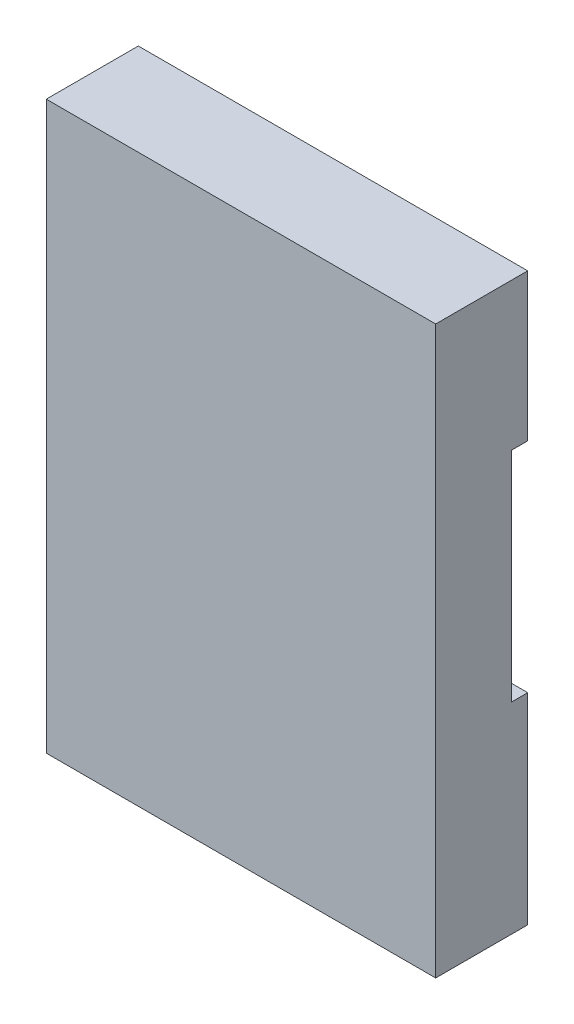
ISO-10303-21;
HEADER;
FILE_DESCRIPTION(('STEP AP214'),'2;1');
FILE_NAME('part.step','',(''),(''),'','','');
FILE_SCHEMA(('AUTOMOTIVE_DESIGN { 1 0 10303 214 1 1 1 1 }'));
ENDSEC;
DATA;
#1=APPLICATION_CONTEXT('core data for automotive mechanical design processes');
#2=APPLICATION_PROTOCOL_DEFINITION('international standard','automotive_design',2000,#1);
#3=PRODUCT_CONTEXT('',#1,'mechanical');
#4=PRODUCT('Part','Part','',(#3));
#5=PRODUCT_RELATED_PRODUCT_CATEGORY('part','',(#4));
#6=PRODUCT_DEFINITION_FORMATION('','',#4);
#7=PRODUCT_DEFINITION_CONTEXT('part definition',#1,'design');
#8=PRODUCT_DEFINITION('design','',#6,#7);
#9=PRODUCT_DEFINITION_SHAPE('','',#8);
#10=(LENGTH_UNIT() NAMED_UNIT(*) SI_UNIT(.MILLI.,.METRE.));
#11=(NAMED_UNIT(*) PLANE_ANGLE_UNIT() SI_UNIT($,.RADIAN.));
#12=(NAMED_UNIT(*) SI_UNIT($,.STERADIAN.) SOLID_ANGLE_UNIT());
#13=UNCERTAINTY_MEASURE_WITH_UNIT(LENGTH_MEASURE(1.E-05),#10,'distance_accuracy_value','');
#14=(GEOMETRIC_REPRESENTATION_CONTEXT(3) GLOBAL_UNCERTAINTY_ASSIGNED_CONTEXT((#13)) GLOBAL_UNIT_ASSIGNED_CONTEXT((#10,
#11,#12)) REPRESENTATION_CONTEXT('',''));
#15=CARTESIAN_POINT('',(0.,0.,0.));
#16=DIRECTION('',(0.,0.,1.));
#17=DIRECTION('',(1.,0.,0.));
#18=AXIS2_PLACEMENT_3D('',#15,#16,#17);
#19=CARTESIAN_POINT('',(13.75,20.,6.5));
#20=DIRECTION('',(-1.,0.,0.));
#21=DIRECTION('',(0.,-1.,0.));
#22=AXIS2_PLACEMENT_3D('',#19,#20,#21);
#23=PLANE('',#22);
#24=DIRECTION('',(0.,-1.,0.));
#25=VECTOR('',#24,1.);
#26=CARTESIAN_POINT('',(13.75,9.6,1.15));
#27=LINE('',#26,#25);
#28=CARTESIAN_POINT('',(13.75,9.6,1.15));
#29=VERTEX_POINT('',#28);
#30=CARTESIAN_POINT('',(13.75,-5.8,1.15));
#31=VERTEX_POINT('',#30);
#32=EDGE_CURVE('E181',#29,#31,#27,.T.);
#33=ORIENTED_EDGE('',*,*,#32,.F.);
#34=DIRECTION('',(0.,0.,-1.));
#35=VECTOR('',#34,1.);
#36=CARTESIAN_POINT('',(13.75,9.6,1.15));
#37=LINE('',#36,#35);
#38=CARTESIAN_POINT('',(13.75,9.6,0.));
#39=VERTEX_POINT('',#38);
#40=EDGE_CURVE('E206',#29,#39,#37,.T.);
#41=ORIENTED_EDGE('',*,*,#40,.T.);
#42=DIRECTION('',(0.,1.,0.));
#43=VECTOR('',#42,1.);
#44=CARTESIAN_POINT('',(13.75,20.,0.));
#45=LINE('',#44,#43);
#46=CARTESIAN_POINT('',(13.75,20.,0.));
#47=VERTEX_POINT('',#46);
#48=EDGE_CURVE('E210',#39,#47,#45,.T.);
#49=ORIENTED_EDGE('',*,*,#48,.T.);
#50=DIRECTION('',(0.,0.,-1.));
#51=VECTOR('',#50,1.);
#52=CARTESIAN_POINT('',(13.75,20.,6.5));
#53=LINE('',#52,#51);
#54=CARTESIAN_POINT('',(13.75,20.,6.5));
#55=VERTEX_POINT('',#54);
#56=EDGE_CURVE('E11',#55,#47,#53,.T.);
#57=ORIENTED_EDGE('',*,*,#56,.F.);
#58=DIRECTION('',(0.,1.,0.));
#59=VECTOR('',#58,1.);
#60=CARTESIAN_POINT('',(13.75,20.,6.5));
#61=LINE('',#60,#59);
#62=CARTESIAN_POINT('',(13.75,-20.,6.5));
#63=VERTEX_POINT('',#62);
#64=EDGE_CURVE('E219',#63,#55,#61,.T.);
#65=ORIENTED_EDGE('',*,*,#64,.F.);
#66=DIRECTION('',(0.,0.,-1.));
#67=VECTOR('',#66,1.);
#68=CARTESIAN_POINT('',(13.75,-20.,6.5));
#69=LINE('',#68,#67);
#70=CARTESIAN_POINT('',(13.75,-20.,0.));
#71=VERTEX_POINT('',#70);
#72=EDGE_CURVE('E233',#63,#71,#69,.T.);
#73=ORIENTED_EDGE('',*,*,#72,.T.);
#74=CARTESIAN_POINT('',(13.75,-5.8,0.));
#75=VERTEX_POINT('',#74);
#76=EDGE_CURVE('E234',#71,#75,#45,.T.);
#77=ORIENTED_EDGE('',*,*,#76,.T.);
#78=DIRECTION('',(0.,0.,-1.));
#79=VECTOR('',#78,1.);
#80=CARTESIAN_POINT('',(13.75,-5.8,1.15));
#81=LINE('',#80,#79);
#82=EDGE_CURVE('E64',#31,#75,#81,.T.);
#83=ORIENTED_EDGE('',*,*,#82,.F.);
#84=EDGE_LOOP('',(#33,#41,#49,#57,#65,#73,#77,#83));
#85=FACE_BOUND('',#84,.T.);
#86=ADVANCED_FACE('F41',(#85),#23,.F.);
#87=CARTESIAN_POINT('',(-13.75,20.,6.5));
#88=DIRECTION('',(0.,-1.,0.));
#89=DIRECTION('',(0.,0.,-1.));
#90=AXIS2_PLACEMENT_3D('',#87,#88,#89);
#91=PLANE('',#90);
#92=DIRECTION('',(-1.,0.,0.));
#93=VECTOR('',#92,1.);
#94=CARTESIAN_POINT('',(-13.75,20.,0.));
#95=LINE('',#94,#93);
#96=CARTESIAN_POINT('',(-13.75,20.,0.));
#97=VERTEX_POINT('',#96);
#98=EDGE_CURVE('E238',#47,#97,#95,.T.);
#99=ORIENTED_EDGE('',*,*,#98,.T.);
#100=DIRECTION('',(0.,0.,-1.));
#101=VECTOR('',#100,1.);
#102=CARTESIAN_POINT('',(-13.75,20.,6.5));
#103=LINE('',#102,#101);
#104=CARTESIAN_POINT('',(-13.75,20.,6.5));
#105=VERTEX_POINT('',#104);
#106=EDGE_CURVE('E49',#105,#97,#103,.T.);
#107=ORIENTED_EDGE('',*,*,#106,.F.);
#108=DIRECTION('',(-1.,0.,0.));
#109=VECTOR('',#108,1.);
#110=CARTESIAN_POINT('',(-13.75,20.,6.5));
#111=LINE('',#110,#109);
#112=EDGE_CURVE('E223',#55,#105,#111,.T.);
#113=ORIENTED_EDGE('',*,*,#112,.F.);
#114=ORIENTED_EDGE('',*,*,#56,.T.);
#115=EDGE_LOOP('',(#99,#107,#113,#114));
#116=FACE_BOUND('',#115,.T.);
#117=ADVANCED_FACE('F274',(#116),#91,.F.);
#118=CARTESIAN_POINT('',(-13.75,20.,6.5));
#119=DIRECTION('',(1.,0.,0.));
#120=DIRECTION('',(0.,1.,0.));
#121=AXIS2_PLACEMENT_3D('',#118,#119,#120);
#122=PLANE('',#121);
#123=DIRECTION('',(0.,-1.,0.));
#124=VECTOR('',#123,1.);
#125=CARTESIAN_POINT('',(-13.75,20.,0.));
#126=LINE('',#125,#124);
#127=CARTESIAN_POINT('',(-13.75,-20.,0.));
#128=VERTEX_POINT('',#127);
#129=EDGE_CURVE('E241',#97,#128,#126,.T.);
#130=ORIENTED_EDGE('',*,*,#129,.T.);
#131=DIRECTION('',(0.,0.,-1.));
#132=VECTOR('',#131,1.);
#133=CARTESIAN_POINT('',(-13.75,-20.,6.5));
#134=LINE('',#133,#132);
#135=CARTESIAN_POINT('',(-13.75,-20.,6.5));
#136=VERTEX_POINT('',#135);
#137=EDGE_CURVE('E250',#136,#128,#134,.T.);
#138=ORIENTED_EDGE('',*,*,#137,.F.);
#139=DIRECTION('',(0.,-1.,0.));
#140=VECTOR('',#139,1.);
#141=CARTESIAN_POINT('',(-13.75,20.,6.5));
#142=LINE('',#141,#140);
#143=EDGE_CURVE('E227',#105,#136,#142,.T.);
#144=ORIENTED_EDGE('',*,*,#143,.F.);
#145=ORIENTED_EDGE('',*,*,#106,.T.);
#146=EDGE_LOOP('',(#130,#138,#144,#145));
#147=FACE_BOUND('',#146,.T.);
#148=ADVANCED_FACE('F259',(#147),#122,.F.);
#149=CARTESIAN_POINT('',(-13.75,-20.,6.5));
#150=DIRECTION('',(0.,1.,0.));
#151=DIRECTION('',(0.,0.,1.));
#152=AXIS2_PLACEMENT_3D('',#149,#150,#151);
#153=PLANE('',#152);
#154=DIRECTION('',(-1.,0.,0.));
#155=VECTOR('',#154,1.);
#156=CARTESIAN_POINT('',(7.43638201632279,-20.,1.15));
#157=LINE('',#156,#155);
#158=CARTESIAN_POINT('',(7.43638201632279,-20.,1.15));
#159=VERTEX_POINT('',#158);
#160=CARTESIAN_POINT('',(-7.87577990601562,-20.,1.15));
#161=VERTEX_POINT('',#160);
#162=EDGE_CURVE('E149',#159,#161,#157,.T.);
#163=ORIENTED_EDGE('',*,*,#162,.F.);
#164=DIRECTION('',(0.,0.,-1.));
#165=VECTOR('',#164,1.);
#166=CARTESIAN_POINT('',(7.43638201632279,-20.,1.15));
#167=LINE('',#166,#165);
#168=CARTESIAN_POINT('',(7.43638201632279,-20.,0.));
#169=VERTEX_POINT('',#168);
#170=EDGE_CURVE('E132',#159,#169,#167,.T.);
#171=ORIENTED_EDGE('',*,*,#170,.T.);
#172=DIRECTION('',(1.,0.,0.));
#173=VECTOR('',#172,1.);
#174=CARTESIAN_POINT('',(-13.75,-20.,0.));
#175=LINE('',#174,#173);
#176=EDGE_CURVE('E244',#169,#71,#175,.T.);
#177=ORIENTED_EDGE('',*,*,#176,.T.);
#178=ORIENTED_EDGE('',*,*,#72,.F.);
#179=DIRECTION('',(1.,0.,0.));
#180=VECTOR('',#179,1.);
#181=CARTESIAN_POINT('',(-13.75,-20.,6.5));
#182=LINE('',#181,#180);
#183=EDGE_CURVE('E230',#136,#63,#182,.T.);
#184=ORIENTED_EDGE('',*,*,#183,.F.);
#185=ORIENTED_EDGE('',*,*,#137,.T.);
#186=CARTESIAN_POINT('',(-7.87577990601562,-20.,0.));
#187=VERTEX_POINT('',#186);
#188=EDGE_CURVE('E224',#128,#187,#175,.T.);
#189=ORIENTED_EDGE('',*,*,#188,.T.);
#190=DIRECTION('',(0.,0.,-1.));
#191=VECTOR('',#190,1.);
#192=CARTESIAN_POINT('',(-7.87577990601562,-20.,1.15));
#193=LINE('',#192,#191);
#194=EDGE_CURVE('E56',#161,#187,#193,.T.);
#195=ORIENTED_EDGE('',*,*,#194,.F.);
#196=EDGE_LOOP('',(#163,#171,#177,#178,#184,#185,#189,#195));
#197=FACE_BOUND('',#196,.T.);
#198=ADVANCED_FACE('F154',(#197),#153,.F.);
#199=CARTESIAN_POINT('',(0.,0.,6.5));
#200=DIRECTION('',(0.,0.,1.));
#201=DIRECTION('',(1.,0.,0.));
#202=AXIS2_PLACEMENT_3D('',#199,#200,#201);
#203=PLANE('',#202);
#204=ORIENTED_EDGE('',*,*,#64,.T.);
#205=ORIENTED_EDGE('',*,*,#112,.T.);
#206=ORIENTED_EDGE('',*,*,#143,.T.);
#207=ORIENTED_EDGE('',*,*,#183,.T.);
#208=EDGE_LOOP('',(#204,#205,#206,#207));
#209=FACE_BOUND('',#208,.T.);
#210=ADVANCED_FACE('F272',(#209),#203,.T.);
#211=CARTESIAN_POINT('',(0.,0.,0.));
#212=DIRECTION('',(0.,0.,1.));
#213=DIRECTION('',(1.,0.,0.));
#214=AXIS2_PLACEMENT_3D('',#211,#212,#213);
#215=PLANE('',#214);
#216=ORIENTED_EDGE('',*,*,#176,.F.);
#217=DIRECTION('',(0.,-1.,0.));
#218=VECTOR('',#217,1.);
#219=CARTESIAN_POINT('',(7.43638201632279,-20.,0.));
#220=LINE('',#219,#218);
#221=CARTESIAN_POINT('',(7.43638201632279,-17.75,0.));
#222=VERTEX_POINT('',#221);
#223=EDGE_CURVE('E138',#222,#169,#220,.T.);
#224=ORIENTED_EDGE('',*,*,#223,.F.);
#225=DIRECTION('',(1.,0.,0.));
#226=VECTOR('',#225,1.);
#227=CARTESIAN_POINT('',(7.43638201632279,-17.75,0.));
#228=LINE('',#227,#226);
#229=CARTESIAN_POINT('',(-7.87577990601562,-17.75,0.));
#230=VERTEX_POINT('',#229);
#231=EDGE_CURVE('E152',#230,#222,#228,.T.);
#232=ORIENTED_EDGE('',*,*,#231,.F.);
#233=DIRECTION('',(0.,1.,0.));
#234=VECTOR('',#233,1.);
#235=CARTESIAN_POINT('',(-7.87577990601562,-20.,0.));
#236=LINE('',#235,#234);
#237=EDGE_CURVE('E166',#187,#230,#236,.T.);
#238=ORIENTED_EDGE('',*,*,#237,.F.);
#239=ORIENTED_EDGE('',*,*,#188,.F.);
#240=ORIENTED_EDGE('',*,*,#129,.F.);
#241=ORIENTED_EDGE('',*,*,#98,.F.);
#242=ORIENTED_EDGE('',*,*,#48,.F.);
#243=DIRECTION('',(1.,0.,0.));
#244=VECTOR('',#243,1.);
#245=CARTESIAN_POINT('',(13.75,9.6,0.));
#246=LINE('',#245,#244);
#247=CARTESIAN_POINT('',(-3.49999999999999,9.6,0.));
#248=VERTEX_POINT('',#247);
#249=EDGE_CURVE('E186',#248,#39,#246,.T.);
#250=ORIENTED_EDGE('',*,*,#249,.F.);
#251=DIRECTION('',(0.,1.,0.));
#252=VECTOR('',#251,1.);
#253=CARTESIAN_POINT('',(-3.49999999999999,9.6,0.));
#254=LINE('',#253,#252);
#255=CARTESIAN_POINT('',(-3.49999999999999,-5.8,0.));
#256=VERTEX_POINT('',#255);
#257=EDGE_CURVE('E200',#256,#248,#254,.T.);
#258=ORIENTED_EDGE('',*,*,#257,.F.);
#259=DIRECTION('',(-1.,0.,0.));
#260=VECTOR('',#259,1.);
#261=CARTESIAN_POINT('',(13.75,-5.8,0.));
#262=LINE('',#261,#260);
#263=EDGE_CURVE('E175',#75,#256,#262,.T.);
#264=ORIENTED_EDGE('',*,*,#263,.F.);
#265=ORIENTED_EDGE('',*,*,#76,.F.);
#266=EDGE_LOOP('',(#216,#224,#232,#238,#239,#240,#241,#242,#250,#258,#264,#265));
#267=FACE_BOUND('',#266,.T.);
#268=ADVANCED_FACE('F265',(#267),#215,.F.);
#269=CARTESIAN_POINT('',(13.75,9.6,1.15));
#270=DIRECTION('',(0.,1.,0.));
#271=DIRECTION('',(0.,0.,1.));
#272=AXIS2_PLACEMENT_3D('',#269,#270,#271);
#273=PLANE('',#272);
#274=ORIENTED_EDGE('',*,*,#249,.T.);
#275=ORIENTED_EDGE('',*,*,#40,.F.);
#276=DIRECTION('',(1.,0.,0.));
#277=VECTOR('',#276,1.);
#278=CARTESIAN_POINT('',(13.75,9.6,1.15));
#279=LINE('',#278,#277);
#280=CARTESIAN_POINT('',(-3.49999999999999,9.6,1.15));
#281=VERTEX_POINT('',#280);
#282=EDGE_CURVE('E194',#281,#29,#279,.T.);
#283=ORIENTED_EDGE('',*,*,#282,.F.);
#284=DIRECTION('',(0.,0.,-1.));
#285=VECTOR('',#284,1.);
#286=CARTESIAN_POINT('',(-3.49999999999999,9.6,1.15));
#287=LINE('',#286,#285);
#288=EDGE_CURVE('E211',#281,#248,#287,.T.);
#289=ORIENTED_EDGE('',*,*,#288,.T.);
#290=EDGE_LOOP('',(#274,#275,#283,#289));
#291=FACE_BOUND('',#290,.T.);
#292=ADVANCED_FACE('F290',(#291),#273,.F.);
#293=CARTESIAN_POINT('',(-3.49999999999999,9.6,1.15));
#294=DIRECTION('',(-1.,0.,0.));
#295=DIRECTION('',(0.,0.,1.));
#296=AXIS2_PLACEMENT_3D('',#293,#294,#295);
#297=PLANE('',#296);
#298=ORIENTED_EDGE('',*,*,#257,.T.);
#299=ORIENTED_EDGE('',*,*,#288,.F.);
#300=DIRECTION('',(0.,1.,0.));
#301=VECTOR('',#300,1.);
#302=CARTESIAN_POINT('',(-3.49999999999999,9.6,1.15));
#303=LINE('',#302,#301);
#304=CARTESIAN_POINT('',(-3.49999999999999,-5.8,1.15));
#305=VERTEX_POINT('',#304);
#306=EDGE_CURVE('E190',#305,#281,#303,.T.);
#307=ORIENTED_EDGE('',*,*,#306,.F.);
#308=DIRECTION('',(0.,0.,-1.));
#309=VECTOR('',#308,1.);
#310=CARTESIAN_POINT('',(-3.49999999999999,-5.8,1.15));
#311=LINE('',#310,#309);
#312=EDGE_CURVE('E214',#305,#256,#311,.T.);
#313=ORIENTED_EDGE('',*,*,#312,.T.);
#314=EDGE_LOOP('',(#298,#299,#307,#313));
#315=FACE_BOUND('',#314,.T.);
#316=ADVANCED_FACE('F285',(#315),#297,.F.);
#317=CARTESIAN_POINT('',(13.75,-5.8,1.15));
#318=DIRECTION('',(0.,-1.,0.));
#319=DIRECTION('',(0.,0.,-1.));
#320=AXIS2_PLACEMENT_3D('',#317,#318,#319);
#321=PLANE('',#320);
#322=ORIENTED_EDGE('',*,*,#263,.T.);
#323=ORIENTED_EDGE('',*,*,#312,.F.);
#324=DIRECTION('',(-1.,0.,0.));
#325=VECTOR('',#324,1.);
#326=CARTESIAN_POINT('',(13.75,-5.8,1.15));
#327=LINE('',#326,#325);
#328=EDGE_CURVE('E185',#31,#305,#327,.T.);
#329=ORIENTED_EDGE('',*,*,#328,.F.);
#330=ORIENTED_EDGE('',*,*,#82,.T.);
#331=EDGE_LOOP('',(#322,#323,#329,#330));
#332=FACE_BOUND('',#331,.T.);
#333=ADVANCED_FACE('F282',(#332),#321,.F.);
#334=CARTESIAN_POINT('',(0.,0.,1.15));
#335=DIRECTION('',(0.,0.,-1.));
#336=DIRECTION('',(-1.,0.,0.));
#337=AXIS2_PLACEMENT_3D('',#334,#335,#336);
#338=PLANE('',#337);
#339=ORIENTED_EDGE('',*,*,#32,.T.);
#340=ORIENTED_EDGE('',*,*,#328,.T.);
#341=ORIENTED_EDGE('',*,*,#306,.T.);
#342=ORIENTED_EDGE('',*,*,#282,.T.);
#343=EDGE_LOOP('',(#339,#340,#341,#342));
#344=FACE_BOUND('',#343,.T.);
#345=ADVANCED_FACE('F288',(#344),#338,.T.);
#346=CARTESIAN_POINT('',(7.43638201632279,-20.,1.15));
#347=DIRECTION('',(1.,0.,0.));
#348=DIRECTION('',(0.,0.,-1.));
#349=AXIS2_PLACEMENT_3D('',#346,#347,#348);
#350=PLANE('',#349);
#351=ORIENTED_EDGE('',*,*,#223,.T.);
#352=ORIENTED_EDGE('',*,*,#170,.F.);
#353=DIRECTION('',(0.,-1.,0.));
#354=VECTOR('',#353,1.);
#355=CARTESIAN_POINT('',(7.43638201632279,-20.,1.15));
#356=LINE('',#355,#354);
#357=CARTESIAN_POINT('',(7.43638201632279,-17.75,1.15));
#358=VERTEX_POINT('',#357);
#359=EDGE_CURVE('E135',#358,#159,#356,.T.);
#360=ORIENTED_EDGE('',*,*,#359,.F.);
#361=DIRECTION('',(0.,0.,-1.));
#362=VECTOR('',#361,1.);
#363=CARTESIAN_POINT('',(7.43638201632279,-17.75,1.15));
#364=LINE('',#363,#362);
#365=EDGE_CURVE('E172',#358,#222,#364,.T.);
#366=ORIENTED_EDGE('',*,*,#365,.T.);
#367=EDGE_LOOP('',(#351,#352,#360,#366));
#368=FACE_BOUND('',#367,.T.);
#369=ADVANCED_FACE('F134',(#368),#350,.F.);
#370=CARTESIAN_POINT('',(7.43638201632279,-17.75,1.15));
#371=DIRECTION('',(0.,1.,0.));
#372=DIRECTION('',(0.,0.,1.));
#373=AXIS2_PLACEMENT_3D('',#370,#371,#372);
#374=PLANE('',#373);
#375=ORIENTED_EDGE('',*,*,#231,.T.);
#376=ORIENTED_EDGE('',*,*,#365,.F.);
#377=DIRECTION('',(1.,0.,0.));
#378=VECTOR('',#377,1.);
#379=CARTESIAN_POINT('',(7.43638201632279,-17.75,1.15));
#380=LINE('',#379,#378);
#381=CARTESIAN_POINT('',(-7.87577990601562,-17.75,1.15));
#382=VERTEX_POINT('',#381);
#383=EDGE_CURVE('E143',#382,#358,#380,.T.);
#384=ORIENTED_EDGE('',*,*,#383,.F.);
#385=DIRECTION('',(0.,0.,-1.));
#386=VECTOR('',#385,1.);
#387=CARTESIAN_POINT('',(-7.87577990601562,-17.75,1.15));
#388=LINE('',#387,#386);
#389=EDGE_CURVE('E176',#382,#230,#388,.T.);
#390=ORIENTED_EDGE('',*,*,#389,.T.);
#391=EDGE_LOOP('',(#375,#376,#384,#390));
#392=FACE_BOUND('',#391,.T.);
#393=ADVANCED_FACE('F320',(#392),#374,.F.);
#394=CARTESIAN_POINT('',(-7.87577990601562,-20.,1.15));
#395=DIRECTION('',(-1.,0.,0.));
#396=DIRECTION('',(0.,0.,1.));
#397=AXIS2_PLACEMENT_3D('',#394,#395,#396);
#398=PLANE('',#397);
#399=ORIENTED_EDGE('',*,*,#237,.T.);
#400=ORIENTED_EDGE('',*,*,#389,.F.);
#401=DIRECTION('',(0.,1.,0.));
#402=VECTOR('',#401,1.);
#403=CARTESIAN_POINT('',(-7.87577990601562,-20.,1.15));
#404=LINE('',#403,#402);
#405=EDGE_CURVE('E157',#161,#382,#404,.T.);
#406=ORIENTED_EDGE('',*,*,#405,.F.);
#407=ORIENTED_EDGE('',*,*,#194,.T.);
#408=EDGE_LOOP('',(#399,#400,#406,#407));
#409=FACE_BOUND('',#408,.T.);
#410=ADVANCED_FACE('F323',(#409),#398,.F.);
#411=CARTESIAN_POINT('',(0.,0.,1.15));
#412=DIRECTION('',(0.,0.,1.));
#413=DIRECTION('',(1.,0.,0.));
#414=AXIS2_PLACEMENT_3D('',#411,#412,#413);
#415=PLANE('',#414);
#416=ORIENTED_EDGE('',*,*,#359,.T.);
#417=ORIENTED_EDGE('',*,*,#162,.T.);
#418=ORIENTED_EDGE('',*,*,#405,.T.);
#419=ORIENTED_EDGE('',*,*,#383,.T.);
#420=EDGE_LOOP('',(#416,#417,#418,#419));
#421=FACE_BOUND('',#420,.T.);
#422=ADVANCED_FACE('F147',(#421),#415,.F.);
#423=CLOSED_SHELL('',(#86,#117,#148,#198,#210,#268,#292,#316,#333,#345,#369,#393,#410,#422));
#424=MANIFOLD_SOLID_BREP('B2',#423);
#425=ADVANCED_BREP_SHAPE_REPRESENTATION('',(#18,#424),#14);
#426=SHAPE_DEFINITION_REPRESENTATION(#9,#425);
ENDSEC;
END-ISO-10303-21;
